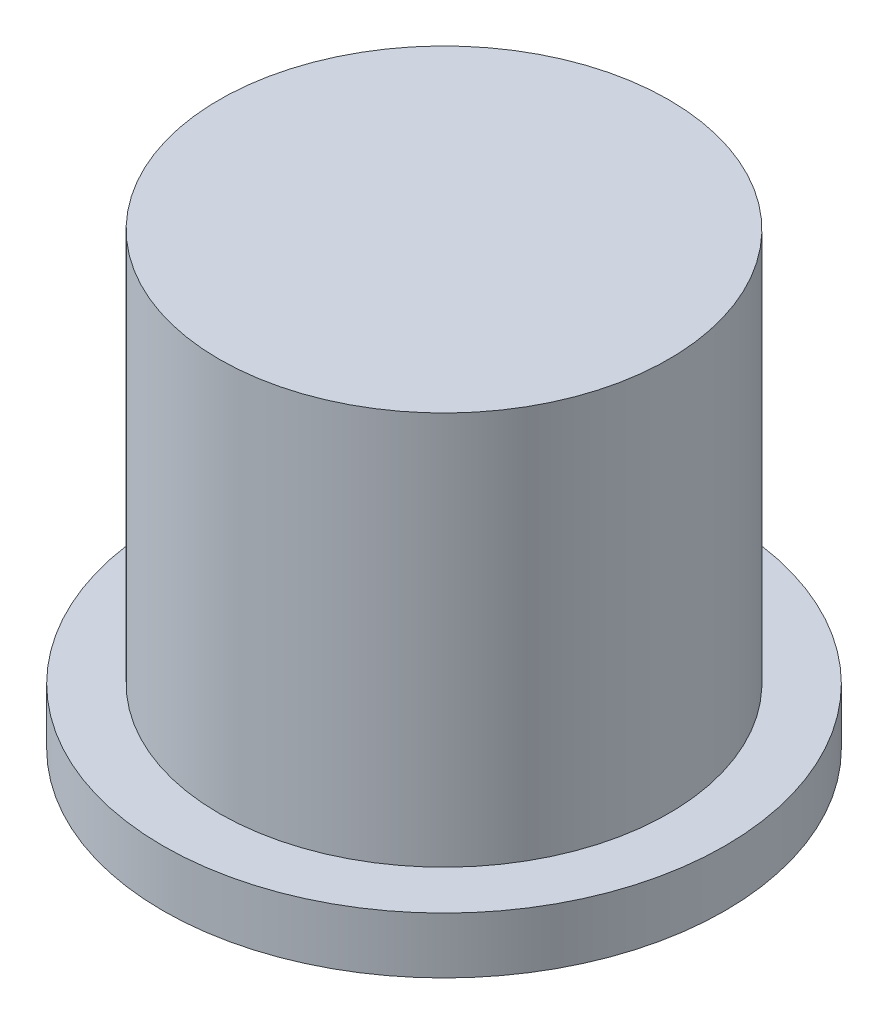
ISO-10303-21;
HEADER;
FILE_DESCRIPTION(('STEP AP214'),'2;1');
FILE_NAME('part.step','',(''),(''),'','','');
FILE_SCHEMA(('AUTOMOTIVE_DESIGN { 1 0 10303 214 1 1 1 1 }'));
ENDSEC;
DATA;
#1=APPLICATION_CONTEXT('core data for automotive mechanical design processes');
#2=APPLICATION_PROTOCOL_DEFINITION('international standard','automotive_design',2000,#1);
#3=PRODUCT_CONTEXT('',#1,'mechanical');
#4=PRODUCT('Part','Part','',(#3));
#5=PRODUCT_RELATED_PRODUCT_CATEGORY('part','',(#4));
#6=PRODUCT_DEFINITION_FORMATION('','',#4);
#7=PRODUCT_DEFINITION_CONTEXT('part definition',#1,'design');
#8=PRODUCT_DEFINITION('design','',#6,#7);
#9=PRODUCT_DEFINITION_SHAPE('','',#8);
#10=(LENGTH_UNIT() NAMED_UNIT(*) SI_UNIT(.MILLI.,.METRE.));
#11=(NAMED_UNIT(*) PLANE_ANGLE_UNIT() SI_UNIT($,.RADIAN.));
#12=(NAMED_UNIT(*) SI_UNIT($,.STERADIAN.) SOLID_ANGLE_UNIT());
#13=UNCERTAINTY_MEASURE_WITH_UNIT(LENGTH_MEASURE(1.E-05),#10,'distance_accuracy_value','');
#14=(GEOMETRIC_REPRESENTATION_CONTEXT(3) GLOBAL_UNCERTAINTY_ASSIGNED_CONTEXT((#13)) GLOBAL_UNIT_ASSIGNED_CONTEXT((#10,
#11,#12)) REPRESENTATION_CONTEXT('',''));
#15=CARTESIAN_POINT('',(0.,0.,0.));
#16=DIRECTION('',(0.,0.,1.));
#17=DIRECTION('',(1.,0.,0.));
#18=AXIS2_PLACEMENT_3D('',#15,#16,#17);
#19=CARTESIAN_POINT('',(0.,2.,0.));
#20=DIRECTION('',(0.,-1.,0.));
#21=DIRECTION('',(0.,0.,-1.));
#22=AXIS2_PLACEMENT_3D('',#19,#20,#21);
#23=CYLINDRICAL_SURFACE('',#22,10.);
#24=CARTESIAN_POINT('',(0.,2.,0.));
#25=DIRECTION('',(0.,1.,0.));
#26=DIRECTION('',(0.,0.,1.));
#27=AXIS2_PLACEMENT_3D('',#24,#25,#26);
#28=CIRCLE('',#27,10.);
#29=CARTESIAN_POINT('',(0.,2.,10.));
#30=VERTEX_POINT('',#29);
#31=EDGE_CURVE('E38',#30,#30,#28,.T.);
#32=ORIENTED_EDGE('',*,*,#31,.F.);
#33=EDGE_LOOP('',(#32));
#34=FACE_BOUND('',#33,.T.);
#35=CARTESIAN_POINT('',(0.,0.,0.));
#36=DIRECTION('',(0.,1.,0.));
#37=DIRECTION('',(0.,0.,1.));
#38=AXIS2_PLACEMENT_3D('',#35,#36,#37);
#39=CIRCLE('',#38,10.);
#40=CARTESIAN_POINT('',(0.,0.,10.));
#41=VERTEX_POINT('',#40);
#42=EDGE_CURVE('E34',#41,#41,#39,.T.);
#43=ORIENTED_EDGE('',*,*,#42,.T.);
#44=EDGE_LOOP('',(#43));
#45=FACE_BOUND('',#44,.T.);
#46=ADVANCED_FACE('F31',(#34,#45),#23,.T.);
#47=CARTESIAN_POINT('',(0.,2.,0.));
#48=DIRECTION('',(0.,1.,0.));
#49=DIRECTION('',(0.,0.,1.));
#50=AXIS2_PLACEMENT_3D('',#47,#48,#49);
#51=PLANE('',#50);
#52=CARTESIAN_POINT('',(0.,2.,0.));
#53=DIRECTION('',(0.,1.,0.));
#54=DIRECTION('',(0.,0.,1.));
#55=AXIS2_PLACEMENT_3D('',#52,#53,#54);
#56=CIRCLE('',#55,8.);
#57=CARTESIAN_POINT('',(0.,2.,8.));
#58=VERTEX_POINT('',#57);
#59=EDGE_CURVE('E10',#58,#58,#56,.T.);
#60=ORIENTED_EDGE('',*,*,#59,.F.);
#61=EDGE_LOOP('',(#60));
#62=FACE_BOUND('',#61,.T.);
#63=ORIENTED_EDGE('',*,*,#31,.T.);
#64=EDGE_LOOP('',(#63));
#65=FACE_BOUND('',#64,.T.);
#66=ADVANCED_FACE('F55',(#62,#65),#51,.T.);
#67=CARTESIAN_POINT('',(0.,0.,0.));
#68=DIRECTION('',(0.,1.,0.));
#69=DIRECTION('',(0.,0.,1.));
#70=AXIS2_PLACEMENT_3D('',#67,#68,#69);
#71=PLANE('',#70);
#72=ORIENTED_EDGE('',*,*,#42,.F.);
#73=EDGE_LOOP('',(#72));
#74=FACE_BOUND('',#73,.T.);
#75=ADVANCED_FACE('F52',(#74),#71,.F.);
#76=CARTESIAN_POINT('',(0.,16.,0.));
#77=DIRECTION('',(0.,-1.,0.));
#78=DIRECTION('',(0.,0.,-1.));
#79=AXIS2_PLACEMENT_3D('',#76,#77,#78);
#80=CYLINDRICAL_SURFACE('',#79,8.);
#81=CARTESIAN_POINT('',(0.,16.,0.));
#82=DIRECTION('',(0.,1.,0.));
#83=DIRECTION('',(0.,0.,1.));
#84=AXIS2_PLACEMENT_3D('',#81,#82,#83);
#85=CIRCLE('',#84,8.);
#86=CARTESIAN_POINT('',(0.,16.,8.));
#87=VERTEX_POINT('',#86);
#88=EDGE_CURVE('E44',#87,#87,#85,.T.);
#89=ORIENTED_EDGE('',*,*,#88,.F.);
#90=EDGE_LOOP('',(#89));
#91=FACE_BOUND('',#90,.T.);
#92=ORIENTED_EDGE('',*,*,#59,.T.);
#93=EDGE_LOOP('',(#92));
#94=FACE_BOUND('',#93,.T.);
#95=ADVANCED_FACE('F54',(#91,#94),#80,.T.);
#96=CARTESIAN_POINT('',(0.,16.,0.));
#97=DIRECTION('',(0.,1.,0.));
#98=DIRECTION('',(0.,0.,1.));
#99=AXIS2_PLACEMENT_3D('',#96,#97,#98);
#100=PLANE('',#99);
#101=ORIENTED_EDGE('',*,*,#88,.T.);
#102=EDGE_LOOP('',(#101));
#103=FACE_BOUND('',#102,.T.);
#104=ADVANCED_FACE('F60',(#103),#100,.T.);
#105=CLOSED_SHELL('',(#46,#66,#75,#95,#104));
#106=MANIFOLD_SOLID_BREP('B2',#105);
#107=ADVANCED_BREP_SHAPE_REPRESENTATION('',(#18,#106),#14);
#108=SHAPE_DEFINITION_REPRESENTATION(#9,#107);
ENDSEC;
END-ISO-10303-21;
